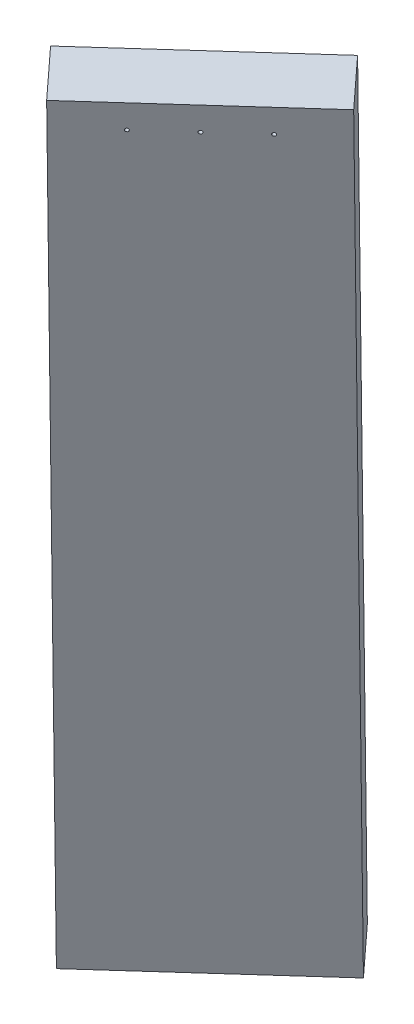
ISO-10303-21;
HEADER;
FILE_DESCRIPTION(('STEP AP214'),'2;1');
FILE_NAME('part.step','',(''),(''),'','','');
FILE_SCHEMA(('AUTOMOTIVE_DESIGN { 1 0 10303 214 1 1 1 1 }'));
ENDSEC;
DATA;
#1=APPLICATION_CONTEXT('core data for automotive mechanical design processes');
#2=APPLICATION_PROTOCOL_DEFINITION('international standard','automotive_design',2000,#1);
#3=PRODUCT_CONTEXT('',#1,'mechanical');
#4=PRODUCT('Part','Part','',(#3));
#5=PRODUCT_RELATED_PRODUCT_CATEGORY('part','',(#4));
#6=PRODUCT_DEFINITION_FORMATION('','',#4);
#7=PRODUCT_DEFINITION_CONTEXT('part definition',#1,'design');
#8=PRODUCT_DEFINITION('design','',#6,#7);
#9=PRODUCT_DEFINITION_SHAPE('','',#8);
#10=(LENGTH_UNIT() NAMED_UNIT(*) SI_UNIT(.MILLI.,.METRE.));
#11=(NAMED_UNIT(*) PLANE_ANGLE_UNIT() SI_UNIT($,.RADIAN.));
#12=(NAMED_UNIT(*) SI_UNIT($,.STERADIAN.) SOLID_ANGLE_UNIT());
#13=UNCERTAINTY_MEASURE_WITH_UNIT(LENGTH_MEASURE(1.E-05),#10,'distance_accuracy_value','');
#14=(GEOMETRIC_REPRESENTATION_CONTEXT(3) GLOBAL_UNCERTAINTY_ASSIGNED_CONTEXT((#13)) GLOBAL_UNIT_ASSIGNED_CONTEXT((#10,
#11,#12)) REPRESENTATION_CONTEXT('',''));
#15=CARTESIAN_POINT('',(0.,0.,0.));
#16=DIRECTION('',(0.,0.,1.));
#17=DIRECTION('',(1.,0.,0.));
#18=AXIS2_PLACEMENT_3D('',#15,#16,#17);
#19=CARTESIAN_POINT('',(-97.7699725279944,128.860107588829,-194.729443761091));
#20=DIRECTION('',(0.115000396020051,0.985316598437953,0.126198691585504));
#21=DIRECTION('',(0.,-0.127041555671891,0.991897395466117));
#22=AXIS2_PLACEMENT_3D('',#19,#20,#21);
#23=PLANE('',#22);
#24=DIRECTION('',(0.742569432859524,-0.000884862255525151,-0.669768508069373));
#25=VECTOR('',#24,1.);
#26=CARTESIAN_POINT('',(-110.339588479382,132.112608091207,-208.669619345232));
#27=LINE('',#26,#25);
#28=CARTESIAN_POINT('',(-110.339588479382,132.112608091207,-208.669619345232));
#29=VERTEX_POINT('',#28);
#30=CARTESIAN_POINT('',(-53.7558192017717,132.045181612963,-259.705960262292));
#31=VERTEX_POINT('',#30);
#32=EDGE_CURVE('E105',#29,#31,#27,.T.);
#33=ORIENTED_EDGE('',*,*,#32,.T.);
#34=DIRECTION('',(-0.659822359652896,0.170734934507998,-0.731767747198955));
#35=VECTOR('',#34,1.);
#36=CARTESIAN_POINT('',(-41.1862032503841,128.792681110586,-245.765784678152));
#37=LINE('',#36,#35);
#38=CARTESIAN_POINT('',(-41.1862032503841,128.792681110586,-245.765784678152));
#39=VERTEX_POINT('',#38);
#40=EDGE_CURVE('E11',#39,#31,#37,.T.);
#41=ORIENTED_EDGE('',*,*,#40,.F.);
#42=DIRECTION('',(0.742569432859524,-0.000884862255525151,-0.669768508069373));
#43=VECTOR('',#42,1.);
#44=CARTESIAN_POINT('',(-97.7699725279944,128.860107588829,-194.729443761091));
#45=LINE('',#44,#43);
#46=CARTESIAN_POINT('',(-97.7699725279944,128.860107588829,-194.729443761091));
#47=VERTEX_POINT('',#46);
#48=EDGE_CURVE('E92',#47,#39,#45,.T.);
#49=ORIENTED_EDGE('',*,*,#48,.F.);
#50=DIRECTION('',(-0.659822359652896,0.170734934507998,-0.731767747198955));
#51=VECTOR('',#50,1.);
#52=CARTESIAN_POINT('',(-97.7699725279944,128.860107588829,-194.729443761091));
#53=LINE('',#52,#51);
#54=EDGE_CURVE('E101',#47,#29,#53,.T.);
#55=ORIENTED_EDGE('',*,*,#54,.T.);
#56=EDGE_LOOP('',(#33,#41,#49,#55));
#57=FACE_BOUND('',#56,.T.);
#58=ADVANCED_FACE('F39',(#57),#23,.F.);
#59=CARTESIAN_POINT('',(-41.1862032503841,128.792681110586,-245.765784678152));
#60=DIRECTION('',(-0.742569432859524,0.000884862255525564,0.669768508069373));
#61=DIRECTION('',(0.669768770277606,0.,0.742569723568652));
#62=AXIS2_PLACEMENT_3D('',#59,#60,#61);
#63=PLANE('',#62);
#64=DIRECTION('',(0.115000396020051,0.985316598437953,0.126198691585504));
#65=VECTOR('',#64,1.);
#66=CARTESIAN_POINT('',(-53.7558192017717,132.045181612963,-259.705960262292));
#67=LINE('',#66,#65);
#68=CARTESIAN_POINT('',(-18.7036984948601,432.369680816851,-221.24059906703));
#69=VERTEX_POINT('',#68);
#70=EDGE_CURVE('E96',#31,#69,#67,.T.);
#71=ORIENTED_EDGE('',*,*,#70,.T.);
#72=DIRECTION('',(-0.659822359652896,0.170734934507998,-0.731767747198955));
#73=VECTOR('',#72,1.);
#74=CARTESIAN_POINT('',(-6.13408254347241,429.117180314474,-207.30042348289));
#75=LINE('',#74,#73);
#76=CARTESIAN_POINT('',(-6.13408254347241,429.117180314474,-207.30042348289));
#77=VERTEX_POINT('',#76);
#78=EDGE_CURVE('E48',#77,#69,#75,.T.);
#79=ORIENTED_EDGE('',*,*,#78,.F.);
#80=DIRECTION('',(0.115000396020051,0.985316598437953,0.126198691585504));
#81=VECTOR('',#80,1.);
#82=CARTESIAN_POINT('',(-41.1862032503841,128.792681110586,-245.765784678152));
#83=LINE('',#82,#81);
#84=EDGE_CURVE('E87',#39,#77,#83,.T.);
#85=ORIENTED_EDGE('',*,*,#84,.F.);
#86=ORIENTED_EDGE('',*,*,#40,.T.);
#87=EDGE_LOOP('',(#71,#79,#85,#86));
#88=FACE_BOUND('',#87,.T.);
#89=ADVANCED_FACE('F95',(#88),#63,.F.);
#90=CARTESIAN_POINT('',(-6.13408254347241,429.117180314474,-207.30042348289));
#91=DIRECTION('',(-0.115000396020051,-0.985316598437953,-0.126198691585504));
#92=DIRECTION('',(0.,0.127041555671891,-0.991897395466117));
#93=AXIS2_PLACEMENT_3D('',#90,#91,#92);
#94=PLANE('',#93);
#95=DIRECTION('',(-0.742569432859524,0.000884862255525151,0.669768508069373));
#96=VECTOR('',#95,1.);
#97=CARTESIAN_POINT('',(-18.7036984948601,432.369680816851,-221.24059906703));
#98=LINE('',#97,#96);
#99=CARTESIAN_POINT('',(-75.2874677724705,432.437107295095,-170.20425814997));
#100=VERTEX_POINT('',#99);
#101=EDGE_CURVE('E74',#69,#100,#98,.T.);
#102=ORIENTED_EDGE('',*,*,#101,.T.);
#103=DIRECTION('',(-0.659822359652896,0.170734934507998,-0.731767747198955));
#104=VECTOR('',#103,1.);
#105=CARTESIAN_POINT('',(-62.7178518210828,429.184606792717,-156.26408256583));
#106=LINE('',#105,#104);
#107=CARTESIAN_POINT('',(-62.7178518210828,429.184606792717,-156.26408256583));
#108=VERTEX_POINT('',#107);
#109=EDGE_CURVE('E97',#108,#100,#106,.T.);
#110=ORIENTED_EDGE('',*,*,#109,.F.);
#111=DIRECTION('',(-0.742569432859524,0.000884862255525151,0.669768508069373));
#112=VECTOR('',#111,1.);
#113=CARTESIAN_POINT('',(-6.13408254347241,429.117180314474,-207.30042348289));
#114=LINE('',#113,#112);
#115=EDGE_CURVE('E90',#77,#108,#114,.T.);
#116=ORIENTED_EDGE('',*,*,#115,.F.);
#117=ORIENTED_EDGE('',*,*,#78,.T.);
#118=EDGE_LOOP('',(#102,#110,#116,#117));
#119=FACE_BOUND('',#118,.T.);
#120=ADVANCED_FACE('F99',(#119),#94,.F.);
#121=CARTESIAN_POINT('',(-62.7178518210828,429.184606792717,-156.26408256583));
#122=DIRECTION('',(0.742569432859524,-0.000884862255525564,-0.669768508069373));
#123=DIRECTION('',(-0.669768770277606,0.,-0.742569723568652));
#124=AXIS2_PLACEMENT_3D('',#121,#122,#123);
#125=PLANE('',#124);
#126=DIRECTION('',(-0.115000396020051,-0.985316598437953,-0.126198691585504));
#127=VECTOR('',#126,1.);
#128=CARTESIAN_POINT('',(-75.2874677724705,432.437107295095,-170.20425814997));
#129=LINE('',#128,#127);
#130=EDGE_CURVE('E80',#100,#29,#129,.T.);
#131=ORIENTED_EDGE('',*,*,#130,.T.);
#132=ORIENTED_EDGE('',*,*,#54,.F.);
#133=DIRECTION('',(-0.115000396020051,-0.985316598437953,-0.126198691585504));
#134=VECTOR('',#133,1.);
#135=CARTESIAN_POINT('',(-62.7178518210828,429.184606792717,-156.26408256583));
#136=LINE('',#135,#134);
#137=EDGE_CURVE('E57',#108,#47,#136,.T.);
#138=ORIENTED_EDGE('',*,*,#137,.F.);
#139=ORIENTED_EDGE('',*,*,#109,.T.);
#140=EDGE_LOOP('',(#131,#132,#138,#139));
#141=FACE_BOUND('',#140,.T.);
#142=ADVANCED_FACE('F164',(#141),#125,.F.);
#143=CARTESIAN_POINT('',(-151.104904028615,39.0997448263721,-167.581006605933));
#144=DIRECTION('',(0.659822359652896,-0.170734934507998,0.731767747198955));
#145=DIRECTION('',(0.742672409332212,0.,-0.669654905467501));
#146=AXIS2_PLACEMENT_3D('',#143,#144,#145);
#147=PLANE('',#146);
#148=CARTESIAN_POINT('',(-49.0825943241463,419.781912838718,-170.752581345834));
#149=DIRECTION('',(0.659822359652896,-0.170734934507998,0.731767747198955));
#150=DIRECTION('',(0.742672409332212,0.,-0.669654905467501));
#151=AXIS2_PLACEMENT_3D('',#148,#149,#150);
#152=CIRCLE('',#151,0.634999999999944);
#153=CARTESIAN_POINT('',(-48.6109973442204,419.781912838718,-171.177812210806));
#154=VERTEX_POINT('',#153);
#155=EDGE_CURVE('E108',#154,#154,#152,.T.);
#156=ORIENTED_EDGE('',*,*,#155,.F.);
#157=EDGE_LOOP('',(#156));
#158=FACE_BOUND('',#157,.T.);
#159=CARTESIAN_POINT('',(-35.5213459543687,419.765752953474,-182.984295561712));
#160=DIRECTION('',(0.659822359652896,-0.170734934507998,0.731767747198955));
#161=DIRECTION('',(0.742672409332212,0.,-0.669654905467501));
#162=AXIS2_PLACEMENT_3D('',#159,#160,#161);
#163=CIRCLE('',#162,0.635000000000017);
#164=CARTESIAN_POINT('',(-35.0497489744427,419.765752953474,-183.409526426684));
#165=VERTEX_POINT('',#164);
#166=EDGE_CURVE('E119',#165,#165,#163,.T.);
#167=ORIENTED_EDGE('',*,*,#166,.F.);
#168=EDGE_LOOP('',(#167));
#169=FACE_BOUND('',#168,.T.);
#170=CARTESIAN_POINT('',(-21.9600975845909,419.749593068231,-195.21600977759));
#171=DIRECTION('',(0.659822359652896,-0.170734934507998,0.731767747198955));
#172=DIRECTION('',(0.742672409332212,0.,-0.669654905467501));
#173=AXIS2_PLACEMENT_3D('',#170,#171,#172);
#174=CIRCLE('',#173,0.634999999999992);
#175=CARTESIAN_POINT('',(-21.488500604665,419.749593068231,-195.641240642562));
#176=VERTEX_POINT('',#175);
#177=EDGE_CURVE('E116',#176,#176,#174,.T.);
#178=ORIENTED_EDGE('',*,*,#177,.F.);
#179=EDGE_LOOP('',(#178));
#180=FACE_BOUND('',#179,.T.);
#181=ORIENTED_EDGE('',*,*,#48,.T.);
#182=ORIENTED_EDGE('',*,*,#84,.T.);
#183=ORIENTED_EDGE('',*,*,#115,.T.);
#184=ORIENTED_EDGE('',*,*,#137,.T.);
#185=EDGE_LOOP('',(#181,#182,#183,#184));
#186=FACE_BOUND('',#185,.T.);
#187=ADVANCED_FACE('F88',(#158,#169,#180,#186),#147,.T.);
#188=CARTESIAN_POINT('',(-163.674519980003,42.3522453287495,-181.521182190073));
#189=DIRECTION('',(0.659822359652896,-0.170734934507998,0.731767747198955));
#190=DIRECTION('',(0.742672409332212,0.,-0.669654905467501));
#191=AXIS2_PLACEMENT_3D('',#188,#189,#190);
#192=PLANE('',#191);
#193=CARTESIAN_POINT('',(-61.652210275534,423.034413341095,-184.692756929974));
#194=DIRECTION('',(0.659822359652896,-0.170734934507998,0.731767747198955));
#195=DIRECTION('',(0.742672409332212,0.,-0.669654905467501));
#196=AXIS2_PLACEMENT_3D('',#193,#194,#195);
#197=CIRCLE('',#196,0.634999999999944);
#198=CARTESIAN_POINT('',(-61.1806132956081,423.034413341095,-185.117987794946));
#199=VERTEX_POINT('',#198);
#200=EDGE_CURVE('E42',#199,#199,#197,.T.);
#201=ORIENTED_EDGE('',*,*,#200,.T.);
#202=EDGE_LOOP('',(#201));
#203=FACE_BOUND('',#202,.T.);
#204=CARTESIAN_POINT('',(-48.0909619057563,423.018253455852,-196.924471145852));
#205=DIRECTION('',(0.659822359652896,-0.170734934507998,0.731767747198955));
#206=DIRECTION('',(0.742672409332212,0.,-0.669654905467501));
#207=AXIS2_PLACEMENT_3D('',#204,#205,#206);
#208=CIRCLE('',#207,0.635000000000017);
#209=CARTESIAN_POINT('',(-47.6193649258304,423.018253455852,-197.349702010824));
#210=VERTEX_POINT('',#209);
#211=EDGE_CURVE('E117',#210,#210,#208,.T.);
#212=ORIENTED_EDGE('',*,*,#211,.T.);
#213=EDGE_LOOP('',(#212));
#214=FACE_BOUND('',#213,.T.);
#215=CARTESIAN_POINT('',(-34.5297135359786,423.002093570608,-209.15618536173));
#216=DIRECTION('',(0.659822359652896,-0.170734934507998,0.731767747198955));
#217=DIRECTION('',(0.742672409332212,0.,-0.669654905467501));
#218=AXIS2_PLACEMENT_3D('',#215,#216,#217);
#219=CIRCLE('',#218,0.634999999999992);
#220=CARTESIAN_POINT('',(-34.0581165560527,423.002093570608,-209.581416226702));
#221=VERTEX_POINT('',#220);
#222=EDGE_CURVE('E114',#221,#221,#219,.T.);
#223=ORIENTED_EDGE('',*,*,#222,.T.);
#224=EDGE_LOOP('',(#223));
#225=FACE_BOUND('',#224,.T.);
#226=ORIENTED_EDGE('',*,*,#32,.F.);
#227=ORIENTED_EDGE('',*,*,#130,.F.);
#228=ORIENTED_EDGE('',*,*,#101,.F.);
#229=ORIENTED_EDGE('',*,*,#70,.F.);
#230=EDGE_LOOP('',(#226,#227,#228,#229));
#231=FACE_BOUND('',#230,.T.);
#232=ADVANCED_FACE('F135',(#203,#214,#225,#231),#192,.F.);
#233=CARTESIAN_POINT('',(-121.877913588961,445.604221245219,-306.028615705375));
#234=DIRECTION('',(0.659822359652897,-0.170734934507998,0.731767747198955));
#235=DIRECTION('',(0.742672409332212,0.,-0.669654905467501));
#236=AXIS2_PLACEMENT_3D('',#233,#234,#235);
#237=CYLINDRICAL_SURFACE('',#236,0.634999999999992);
#238=ORIENTED_EDGE('',*,*,#177,.T.);
#239=EDGE_LOOP('',(#238));
#240=FACE_BOUND('',#239,.T.);
#241=ORIENTED_EDGE('',*,*,#222,.F.);
#242=EDGE_LOOP('',(#241));
#243=FACE_BOUND('',#242,.T.);
#244=ADVANCED_FACE('F145',(#240,#243),#237,.F.);
#245=CARTESIAN_POINT('',(-135.439161958739,445.620381130462,-293.796901489497));
#246=DIRECTION('',(0.659822359652897,-0.170734934507998,0.731767747198955));
#247=DIRECTION('',(0.742672409332212,0.,-0.669654905467501));
#248=AXIS2_PLACEMENT_3D('',#245,#246,#247);
#249=CYLINDRICAL_SURFACE('',#248,0.635000000000017);
#250=ORIENTED_EDGE('',*,*,#166,.T.);
#251=EDGE_LOOP('',(#250));
#252=FACE_BOUND('',#251,.T.);
#253=ORIENTED_EDGE('',*,*,#211,.F.);
#254=EDGE_LOOP('',(#253));
#255=FACE_BOUND('',#254,.T.);
#256=ADVANCED_FACE('F139',(#252,#255),#249,.F.);
#257=CARTESIAN_POINT('',(-149.000410328517,445.636541015705,-281.565187273619));
#258=DIRECTION('',(0.659822359652897,-0.170734934507998,0.731767747198955));
#259=DIRECTION('',(0.742672409332212,0.,-0.669654905467501));
#260=AXIS2_PLACEMENT_3D('',#257,#258,#259);
#261=CYLINDRICAL_SURFACE('',#260,0.634999999999944);
#262=ORIENTED_EDGE('',*,*,#155,.T.);
#263=EDGE_LOOP('',(#262));
#264=FACE_BOUND('',#263,.T.);
#265=ORIENTED_EDGE('',*,*,#200,.F.);
#266=EDGE_LOOP('',(#265));
#267=FACE_BOUND('',#266,.T.);
#268=ADVANCED_FACE('F137',(#264,#267),#261,.F.);
#269=CLOSED_SHELL('',(#58,#89,#120,#142,#187,#232,#244,#256,#268));
#270=MANIFOLD_SOLID_BREP('B2',#269);
#271=ADVANCED_BREP_SHAPE_REPRESENTATION('',(#18,#270),#14);
#272=SHAPE_DEFINITION_REPRESENTATION(#9,#271);
ENDSEC;
END-ISO-10303-21;
